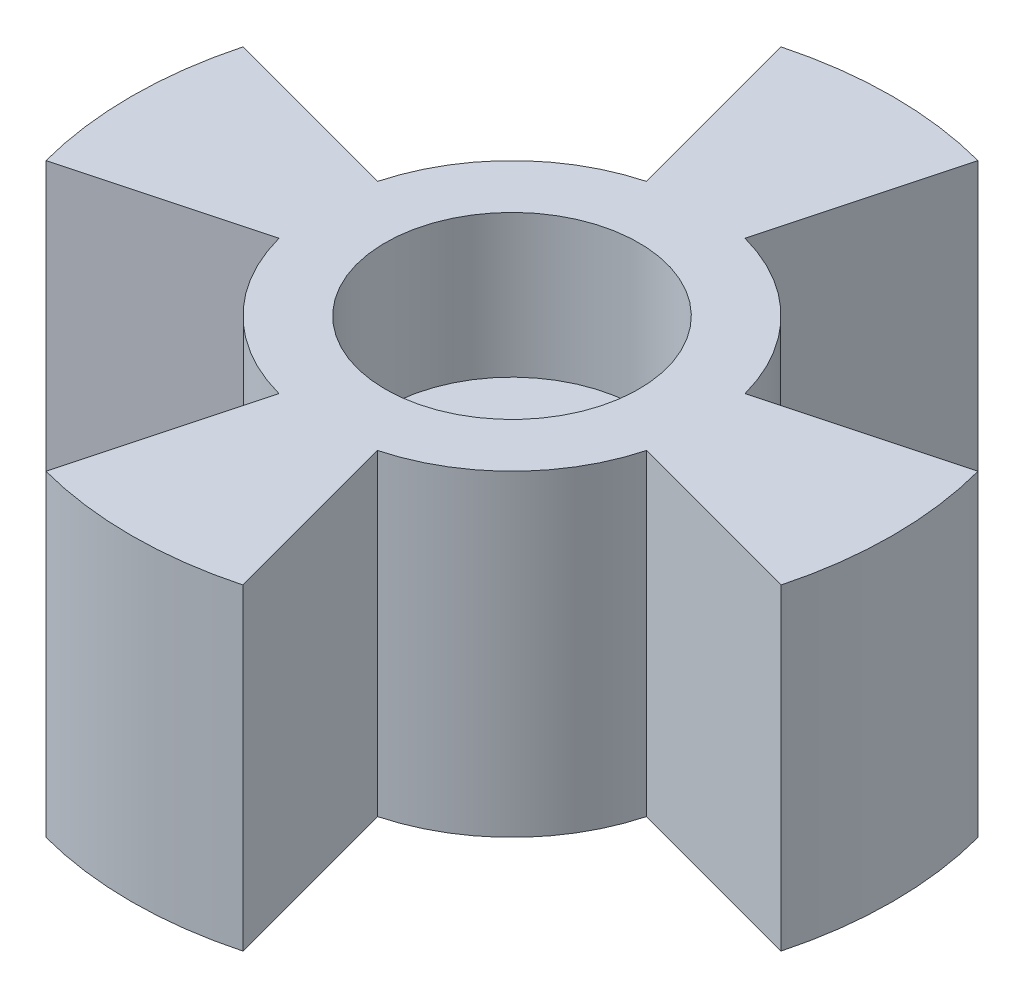
ISO-10303-21;
HEADER;
FILE_DESCRIPTION(('STEP AP214'),'2;1');
FILE_NAME('part.step','',(''),(''),'','','');
FILE_SCHEMA(('AUTOMOTIVE_DESIGN { 1 0 10303 214 1 1 1 1 }'));
ENDSEC;
DATA;
#1=APPLICATION_CONTEXT('core data for automotive mechanical design processes');
#2=APPLICATION_PROTOCOL_DEFINITION('international standard','automotive_design',2000,#1);
#3=PRODUCT_CONTEXT('',#1,'mechanical');
#4=PRODUCT('Part','Part','',(#3));
#5=PRODUCT_RELATED_PRODUCT_CATEGORY('part','',(#4));
#6=PRODUCT_DEFINITION_FORMATION('','',#4);
#7=PRODUCT_DEFINITION_CONTEXT('part definition',#1,'design');
#8=PRODUCT_DEFINITION('design','',#6,#7);
#9=PRODUCT_DEFINITION_SHAPE('','',#8);
#10=(LENGTH_UNIT() NAMED_UNIT(*) SI_UNIT(.MILLI.,.METRE.));
#11=(NAMED_UNIT(*) PLANE_ANGLE_UNIT() SI_UNIT($,.RADIAN.));
#12=(NAMED_UNIT(*) SI_UNIT($,.STERADIAN.) SOLID_ANGLE_UNIT());
#13=UNCERTAINTY_MEASURE_WITH_UNIT(LENGTH_MEASURE(1.E-05),#10,'distance_accuracy_value','');
#14=(GEOMETRIC_REPRESENTATION_CONTEXT(3) GLOBAL_UNCERTAINTY_ASSIGNED_CONTEXT((#13)) GLOBAL_UNIT_ASSIGNED_CONTEXT((#10,
#11,#12)) REPRESENTATION_CONTEXT('',''));
#15=CARTESIAN_POINT('',(0.,0.,0.));
#16=DIRECTION('',(0.,0.,1.));
#17=DIRECTION('',(1.,0.,0.));
#18=AXIS2_PLACEMENT_3D('',#15,#16,#17);
#19=CARTESIAN_POINT('',(0.,5.5,0.));
#20=DIRECTION('',(0.,1.,0.));
#21=DIRECTION('',(0.,0.,1.));
#22=AXIS2_PLACEMENT_3D('',#19,#20,#21);
#23=PLANE('',#22);
#24=CARTESIAN_POINT('',(0.,5.5,0.));
#25=DIRECTION('',(0.,1.,0.));
#26=DIRECTION('',(0.,0.,1.));
#27=AXIS2_PLACEMENT_3D('',#24,#25,#26);
#28=CIRCLE('',#27,4.);
#29=CARTESIAN_POINT('',(0.,5.5,4.));
#30=VERTEX_POINT('',#29);
#31=EDGE_CURVE('E20',#30,#30,#28,.T.);
#32=ORIENTED_EDGE('',*,*,#31,.T.);
#33=EDGE_LOOP('',(#32));
#34=FACE_BOUND('',#33,.T.);
#35=ADVANCED_FACE('F17',(#34),#23,.T.);
#36=CARTESIAN_POINT('',(0.,5.5,0.));
#37=DIRECTION('',(0.,1.,0.));
#38=DIRECTION('',(0.,0.,1.));
#39=AXIS2_PLACEMENT_3D('',#36,#37,#38);
#40=CYLINDRICAL_SURFACE('',#39,4.);
#41=CARTESIAN_POINT('',(0.,10.,0.));
#42=DIRECTION('',(0.,1.,0.));
#43=DIRECTION('',(0.,0.,1.));
#44=AXIS2_PLACEMENT_3D('',#41,#42,#43);
#45=CIRCLE('',#44,4.);
#46=CARTESIAN_POINT('',(0.,10.,4.));
#47=VERTEX_POINT('',#46);
#48=EDGE_CURVE('E155',#47,#47,#45,.F.);
#49=ORIENTED_EDGE('',*,*,#48,.F.);
#50=EDGE_LOOP('',(#49));
#51=FACE_BOUND('',#50,.T.);
#52=ORIENTED_EDGE('',*,*,#31,.F.);
#53=EDGE_LOOP('',(#52));
#54=FACE_BOUND('',#53,.T.);
#55=ADVANCED_FACE('F241',(#51,#54),#40,.F.);
#56=CARTESIAN_POINT('',(0.,4.5,0.));
#57=DIRECTION('',(0.,-1.,0.));
#58=DIRECTION('',(0.,0.,-1.));
#59=AXIS2_PLACEMENT_3D('',#56,#57,#58);
#60=PLANE('',#59);
#61=CARTESIAN_POINT('',(0.,4.5,0.));
#62=DIRECTION('',(0.,-1.,0.));
#63=DIRECTION('',(0.,0.,-1.));
#64=AXIS2_PLACEMENT_3D('',#61,#62,#63);
#65=CIRCLE('',#64,4.);
#66=CARTESIAN_POINT('',(0.,4.5,-4.));
#67=VERTEX_POINT('',#66);
#68=EDGE_CURVE('E152',#67,#67,#65,.T.);
#69=ORIENTED_EDGE('',*,*,#68,.T.);
#70=EDGE_LOOP('',(#69));
#71=FACE_BOUND('',#70,.T.);
#72=ADVANCED_FACE('F243',(#71),#60,.T.);
#73=CARTESIAN_POINT('',(0.,10.,0.));
#74=DIRECTION('',(0.,1.,0.));
#75=DIRECTION('',(0.,0.,1.));
#76=AXIS2_PLACEMENT_3D('',#73,#74,#75);
#77=PLANE('',#76);
#78=CARTESIAN_POINT('',(0.,10.,0.));
#79=DIRECTION('',(0.,-1.,0.));
#80=DIRECTION('',(0.,0.,-1.));
#81=AXIS2_PLACEMENT_3D('',#78,#79,#80);
#82=CIRCLE('',#81,6.00000000000029);
#83=CARTESIAN_POINT('',(1.55291427061518,10.,-5.7955549577347));
#84=VERTEX_POINT('',#83);
#85=CARTESIAN_POINT('',(5.79555495773471,10.,-1.55291427061512));
#86=VERTEX_POINT('',#85);
#87=EDGE_CURVE('E165',#84,#86,#82,.T.);
#88=ORIENTED_EDGE('',*,*,#87,.F.);
#89=DIRECTION('',(-0.258819045102518,0.,0.965925826289069));
#90=VECTOR('',#89,1.);
#91=CARTESIAN_POINT('',(1.55291427061518,10.,-5.7955549577347));
#92=LINE('',#91,#90);
#93=CARTESIAN_POINT('',(3.10582854123021,10.,-11.5911099154688));
#94=VERTEX_POINT('',#93);
#95=EDGE_CURVE('E139',#84,#94,#92,.F.);
#96=ORIENTED_EDGE('',*,*,#95,.T.);
#97=CARTESIAN_POINT('',(0.,10.,0.));
#98=DIRECTION('',(0.,-1.,0.));
#99=DIRECTION('',(0.,0.,-1.));
#100=AXIS2_PLACEMENT_3D('',#97,#98,#99);
#101=CIRCLE('',#100,12.);
#102=CARTESIAN_POINT('',(-3.10582854123021,10.,-11.5911099154688));
#103=VERTEX_POINT('',#102);
#104=EDGE_CURVE('E132',#103,#94,#101,.T.);
#105=ORIENTED_EDGE('',*,*,#104,.F.);
#106=DIRECTION('',(-0.258819045102528,0.,-0.965925826289066));
#107=VECTOR('',#106,1.);
#108=CARTESIAN_POINT('',(-1.55291427061512,10.,-5.79555495773471));
#109=LINE('',#108,#107);
#110=CARTESIAN_POINT('',(-1.55291427061512,10.,-5.79555495773471));
#111=VERTEX_POINT('',#110);
#112=EDGE_CURVE('E136',#103,#111,#109,.F.);
#113=ORIENTED_EDGE('',*,*,#112,.T.);
#114=CARTESIAN_POINT('',(0.,10.,0.));
#115=DIRECTION('',(0.,-1.,0.));
#116=DIRECTION('',(0.,0.,-1.));
#117=AXIS2_PLACEMENT_3D('',#114,#115,#116);
#118=CIRCLE('',#117,6.00000000000029);
#119=CARTESIAN_POINT('',(-5.7955549577347,10.,-1.55291427061518));
#120=VERTEX_POINT('',#119);
#121=EDGE_CURVE('E127',#120,#111,#118,.T.);
#122=ORIENTED_EDGE('',*,*,#121,.F.);
#123=DIRECTION('',(0.965925826289064,0.,0.258819045102538));
#124=VECTOR('',#123,1.);
#125=CARTESIAN_POINT('',(-5.7955549577347,10.,-1.55291427061518));
#126=LINE('',#125,#124);
#127=CARTESIAN_POINT('',(-11.5911099154688,10.,-3.10582854123033));
#128=VERTEX_POINT('',#127);
#129=EDGE_CURVE('E187',#120,#128,#126,.F.);
#130=ORIENTED_EDGE('',*,*,#129,.T.);
#131=CARTESIAN_POINT('',(0.,10.,0.));
#132=DIRECTION('',(0.,-1.,0.));
#133=DIRECTION('',(0.,0.,-1.));
#134=AXIS2_PLACEMENT_3D('',#131,#132,#133);
#135=CIRCLE('',#134,12.);
#136=CARTESIAN_POINT('',(-11.5911099154689,10.,3.10582854123009));
#137=VERTEX_POINT('',#136);
#138=EDGE_CURVE('E189',#137,#128,#135,.T.);
#139=ORIENTED_EDGE('',*,*,#138,.F.);
#140=DIRECTION('',(-0.965925826289072,0.,0.258819045102508));
#141=VECTOR('',#140,1.);
#142=CARTESIAN_POINT('',(-5.79555495773471,10.,1.55291427061512));
#143=LINE('',#142,#141);
#144=CARTESIAN_POINT('',(-5.79555495773471,10.,1.55291427061512));
#145=VERTEX_POINT('',#144);
#146=EDGE_CURVE('E182',#137,#145,#143,.F.);
#147=ORIENTED_EDGE('',*,*,#146,.T.);
#148=CARTESIAN_POINT('',(0.,10.,0.));
#149=DIRECTION('',(0.,-1.,0.));
#150=DIRECTION('',(0.,0.,-1.));
#151=AXIS2_PLACEMENT_3D('',#148,#149,#150);
#152=CIRCLE('',#151,6.00000000000029);
#153=CARTESIAN_POINT('',(-1.55291427061518,10.,5.7955549577347));
#154=VERTEX_POINT('',#153);
#155=EDGE_CURVE('E185',#154,#145,#152,.T.);
#156=ORIENTED_EDGE('',*,*,#155,.F.);
#157=DIRECTION('',(0.258819045102532,0.,-0.965925826289065));
#158=VECTOR('',#157,1.);
#159=CARTESIAN_POINT('',(-1.55291427061518,10.,5.7955549577347));
#160=LINE('',#159,#158);
#161=CARTESIAN_POINT('',(-3.10582854123029,10.,11.5911099154688));
#162=VERTEX_POINT('',#161);
#163=EDGE_CURVE('E177',#154,#162,#160,.F.);
#164=ORIENTED_EDGE('',*,*,#163,.T.);
#165=CARTESIAN_POINT('',(0.,10.,0.));
#166=DIRECTION('',(0.,-1.,0.));
#167=DIRECTION('',(0.,0.,-1.));
#168=AXIS2_PLACEMENT_3D('',#165,#166,#167);
#169=CIRCLE('',#168,12.);
#170=CARTESIAN_POINT('',(3.10582854123013,10.,11.5911099154688));
#171=VERTEX_POINT('',#170);
#172=EDGE_CURVE('E180',#171,#162,#169,.T.);
#173=ORIENTED_EDGE('',*,*,#172,.F.);
#174=DIRECTION('',(0.258819045102514,0.,0.96592582628907));
#175=VECTOR('',#174,1.);
#176=CARTESIAN_POINT('',(1.55291427061512,10.,5.79555495773471));
#177=LINE('',#176,#175);
#178=CARTESIAN_POINT('',(1.55291427061512,10.,5.79555495773471));
#179=VERTEX_POINT('',#178);
#180=EDGE_CURVE('E172',#171,#179,#177,.F.);
#181=ORIENTED_EDGE('',*,*,#180,.T.);
#182=CARTESIAN_POINT('',(0.,10.,0.));
#183=DIRECTION('',(0.,-1.,0.));
#184=DIRECTION('',(0.,0.,-1.));
#185=AXIS2_PLACEMENT_3D('',#182,#183,#184);
#186=CIRCLE('',#185,6.00000000000029);
#187=CARTESIAN_POINT('',(5.7955549577347,10.,1.55291427061518));
#188=VERTEX_POINT('',#187);
#189=EDGE_CURVE('E175',#188,#179,#186,.T.);
#190=ORIENTED_EDGE('',*,*,#189,.F.);
#191=DIRECTION('',(-0.965925826289067,0.,-0.258819045102524));
#192=VECTOR('',#191,1.);
#193=CARTESIAN_POINT('',(5.7955549577347,10.,1.55291427061518));
#194=LINE('',#193,#192);
#195=CARTESIAN_POINT('',(11.5911099154688,10.,3.10582854123025));
#196=VERTEX_POINT('',#195);
#197=EDGE_CURVE('E167',#188,#196,#194,.F.);
#198=ORIENTED_EDGE('',*,*,#197,.T.);
#199=CARTESIAN_POINT('',(0.,10.,0.));
#200=DIRECTION('',(0.,-1.,0.));
#201=DIRECTION('',(0.,0.,-1.));
#202=AXIS2_PLACEMENT_3D('',#199,#200,#201);
#203=CIRCLE('',#202,12.);
#204=CARTESIAN_POINT('',(11.5911099154688,10.,-3.10582854123017));
#205=VERTEX_POINT('',#204);
#206=EDGE_CURVE('E170',#205,#196,#203,.T.);
#207=ORIENTED_EDGE('',*,*,#206,.F.);
#208=DIRECTION('',(0.965925826289068,0.,-0.258819045102521));
#209=VECTOR('',#208,1.);
#210=CARTESIAN_POINT('',(5.79555495773471,10.,-1.55291427061512));
#211=LINE('',#210,#209);
#212=EDGE_CURVE('E162',#205,#86,#211,.F.);
#213=ORIENTED_EDGE('',*,*,#212,.T.);
#214=EDGE_LOOP('',(#88,#96,#105,#113,#122,#130,#139,#147,#156,#164,#173,#181,#190,#198,#207,#213));
#215=FACE_BOUND('',#214,.T.);
#216=ORIENTED_EDGE('',*,*,#48,.T.);
#217=EDGE_LOOP('',(#216));
#218=FACE_BOUND('',#217,.T.);
#219=ADVANCED_FACE('F134',(#215,#218),#77,.T.);
#220=CARTESIAN_POINT('',(0.,4.5,0.));
#221=DIRECTION('',(0.,-1.,0.));
#222=DIRECTION('',(0.,0.,-1.));
#223=AXIS2_PLACEMENT_3D('',#220,#221,#222);
#224=CYLINDRICAL_SURFACE('',#223,4.);
#225=ORIENTED_EDGE('',*,*,#68,.F.);
#226=EDGE_LOOP('',(#225));
#227=FACE_BOUND('',#226,.T.);
#228=CARTESIAN_POINT('',(0.,0.,0.));
#229=DIRECTION('',(0.,-1.,0.));
#230=DIRECTION('',(0.,0.,-1.));
#231=AXIS2_PLACEMENT_3D('',#228,#229,#230);
#232=CIRCLE('',#231,4.);
#233=CARTESIAN_POINT('',(0.,0.,-4.));
#234=VERTEX_POINT('',#233);
#235=EDGE_CURVE('E220',#234,#234,#232,.T.);
#236=ORIENTED_EDGE('',*,*,#235,.T.);
#237=EDGE_LOOP('',(#236));
#238=FACE_BOUND('',#237,.T.);
#239=ADVANCED_FACE('F318',(#227,#238),#224,.F.);
#240=CARTESIAN_POINT('',(-1.55291427061512,10.,-5.79555495773471));
#241=DIRECTION('',(0.965925826289066,0.,-0.258819045102528));
#242=DIRECTION('',(-0.258819045102528,0.,-0.965925826289066));
#243=AXIS2_PLACEMENT_3D('',#240,#241,#242);
#244=PLANE('',#243);
#245=DIRECTION('',(0.,-1.,0.));
#246=VECTOR('',#245,1.);
#247=CARTESIAN_POINT('',(-1.55291427061512,10.,-5.79555495773471));
#248=LINE('',#247,#246);
#249=CARTESIAN_POINT('',(-1.55291427061512,0.,-5.79555495773471));
#250=VERTEX_POINT('',#249);
#251=EDGE_CURVE('E149',#111,#250,#248,.T.);
#252=ORIENTED_EDGE('',*,*,#251,.F.);
#253=ORIENTED_EDGE('',*,*,#112,.F.);
#254=DIRECTION('',(0.,1.,0.));
#255=VECTOR('',#254,1.);
#256=CARTESIAN_POINT('',(-3.10582854123021,10.,-11.5911099154688));
#257=LINE('',#256,#255);
#258=CARTESIAN_POINT('',(-3.10582854123021,0.,-11.5911099154688));
#259=VERTEX_POINT('',#258);
#260=EDGE_CURVE('E148',#259,#103,#257,.T.);
#261=ORIENTED_EDGE('',*,*,#260,.F.);
#262=DIRECTION('',(0.258819045102528,0.,0.965925826289066));
#263=VECTOR('',#262,1.);
#264=CARTESIAN_POINT('',(-3.10582854123021,0.,-11.5911099154688));
#265=LINE('',#264,#263);
#266=EDGE_CURVE('E218',#259,#250,#265,.T.);
#267=ORIENTED_EDGE('',*,*,#266,.T.);
#268=EDGE_LOOP('',(#252,#253,#261,#267));
#269=FACE_BOUND('',#268,.T.);
#270=ADVANCED_FACE('F146',(#269),#244,.F.);
#271=CARTESIAN_POINT('',(0.,10.,0.));
#272=DIRECTION('',(0.,-1.,0.));
#273=DIRECTION('',(0.,0.,-1.));
#274=AXIS2_PLACEMENT_3D('',#271,#272,#273);
#275=CYLINDRICAL_SURFACE('',#274,6.00000000000029);
#276=ORIENTED_EDGE('',*,*,#121,.T.);
#277=ORIENTED_EDGE('',*,*,#251,.T.);
#278=CARTESIAN_POINT('',(0.,0.,0.));
#279=DIRECTION('',(0.,-1.,0.));
#280=DIRECTION('',(0.,0.,-1.));
#281=AXIS2_PLACEMENT_3D('',#278,#279,#280);
#282=CIRCLE('',#281,6.00000000000029);
#283=CARTESIAN_POINT('',(-5.7955549577347,0.,-1.55291427061518));
#284=VERTEX_POINT('',#283);
#285=EDGE_CURVE('E215',#250,#284,#282,.F.);
#286=ORIENTED_EDGE('',*,*,#285,.T.);
#287=DIRECTION('',(0.,1.,0.));
#288=VECTOR('',#287,1.);
#289=CARTESIAN_POINT('',(-5.7955549577347,10.,-1.55291427061518));
#290=LINE('',#289,#288);
#291=EDGE_CURVE('E190',#284,#120,#290,.T.);
#292=ORIENTED_EDGE('',*,*,#291,.T.);
#293=EDGE_LOOP('',(#276,#277,#286,#292));
#294=FACE_BOUND('',#293,.T.);
#295=ADVANCED_FACE('F312',(#294),#275,.T.);
#296=CARTESIAN_POINT('',(-5.7955549577347,10.,-1.55291427061518));
#297=DIRECTION('',(-0.258819045102538,0.,0.965925826289064));
#298=DIRECTION('',(0.965925826289064,0.,0.258819045102538));
#299=AXIS2_PLACEMENT_3D('',#296,#297,#298);
#300=PLANE('',#299);
#301=DIRECTION('',(0.,-1.,0.));
#302=VECTOR('',#301,1.);
#303=CARTESIAN_POINT('',(-11.5911099154688,10.,-3.10582854123033));
#304=LINE('',#303,#302);
#305=CARTESIAN_POINT('',(-11.5911099154688,0.,-3.10582854123033));
#306=VERTEX_POINT('',#305);
#307=EDGE_CURVE('E234',#128,#306,#304,.T.);
#308=ORIENTED_EDGE('',*,*,#307,.F.);
#309=ORIENTED_EDGE('',*,*,#129,.F.);
#310=ORIENTED_EDGE('',*,*,#291,.F.);
#311=DIRECTION('',(-0.965925826289063,0.,-0.258819045102538));
#312=VECTOR('',#311,1.);
#313=CARTESIAN_POINT('',(-5.7955549577347,0.,-1.55291427061518));
#314=LINE('',#313,#312);
#315=EDGE_CURVE('E214',#284,#306,#314,.T.);
#316=ORIENTED_EDGE('',*,*,#315,.T.);
#317=EDGE_LOOP('',(#308,#309,#310,#316));
#318=FACE_BOUND('',#317,.T.);
#319=ADVANCED_FACE('F308',(#318),#300,.F.);
#320=CARTESIAN_POINT('',(0.,10.,0.));
#321=DIRECTION('',(0.,-1.,0.));
#322=DIRECTION('',(0.,0.,-1.));
#323=AXIS2_PLACEMENT_3D('',#320,#321,#322);
#324=CYLINDRICAL_SURFACE('',#323,12.);
#325=ORIENTED_EDGE('',*,*,#138,.T.);
#326=ORIENTED_EDGE('',*,*,#307,.T.);
#327=CARTESIAN_POINT('',(0.,0.,0.));
#328=DIRECTION('',(0.,-1.,0.));
#329=DIRECTION('',(0.,0.,-1.));
#330=AXIS2_PLACEMENT_3D('',#327,#328,#329);
#331=CIRCLE('',#330,12.);
#332=CARTESIAN_POINT('',(-11.5911099154689,0.,3.10582854123009));
#333=VERTEX_POINT('',#332);
#334=EDGE_CURVE('E211',#306,#333,#331,.F.);
#335=ORIENTED_EDGE('',*,*,#334,.T.);
#336=DIRECTION('',(0.,1.,0.));
#337=VECTOR('',#336,1.);
#338=CARTESIAN_POINT('',(-11.5911099154689,10.,3.10582854123009));
#339=LINE('',#338,#337);
#340=EDGE_CURVE('E186',#333,#137,#339,.T.);
#341=ORIENTED_EDGE('',*,*,#340,.T.);
#342=EDGE_LOOP('',(#325,#326,#335,#341));
#343=FACE_BOUND('',#342,.T.);
#344=ADVANCED_FACE('F304',(#343),#324,.T.);
#345=CARTESIAN_POINT('',(-5.79555495773471,10.,1.55291427061512));
#346=DIRECTION('',(-0.258819045102508,0.,-0.965925826289072));
#347=DIRECTION('',(-0.965925826289072,0.,0.258819045102508));
#348=AXIS2_PLACEMENT_3D('',#345,#346,#347);
#349=PLANE('',#348);
#350=DIRECTION('',(0.,-1.,0.));
#351=VECTOR('',#350,1.);
#352=CARTESIAN_POINT('',(-5.79555495773471,10.,1.55291427061512));
#353=LINE('',#352,#351);
#354=CARTESIAN_POINT('',(-5.79555495773471,0.,1.55291427061512));
#355=VERTEX_POINT('',#354);
#356=EDGE_CURVE('E232',#145,#355,#353,.T.);
#357=ORIENTED_EDGE('',*,*,#356,.F.);
#358=ORIENTED_EDGE('',*,*,#146,.F.);
#359=ORIENTED_EDGE('',*,*,#340,.F.);
#360=DIRECTION('',(0.965925826289072,0.,-0.258819045102507));
#361=VECTOR('',#360,1.);
#362=CARTESIAN_POINT('',(-11.5911099154689,0.,3.10582854123009));
#363=LINE('',#362,#361);
#364=EDGE_CURVE('E210',#333,#355,#363,.T.);
#365=ORIENTED_EDGE('',*,*,#364,.T.);
#366=EDGE_LOOP('',(#357,#358,#359,#365));
#367=FACE_BOUND('',#366,.T.);
#368=ADVANCED_FACE('F300',(#367),#349,.F.);
#369=CARTESIAN_POINT('',(0.,10.,0.));
#370=DIRECTION('',(0.,-1.,0.));
#371=DIRECTION('',(0.,0.,-1.));
#372=AXIS2_PLACEMENT_3D('',#369,#370,#371);
#373=CYLINDRICAL_SURFACE('',#372,6.00000000000029);
#374=ORIENTED_EDGE('',*,*,#155,.T.);
#375=ORIENTED_EDGE('',*,*,#356,.T.);
#376=CARTESIAN_POINT('',(0.,0.,0.));
#377=DIRECTION('',(0.,-1.,0.));
#378=DIRECTION('',(0.,0.,-1.));
#379=AXIS2_PLACEMENT_3D('',#376,#377,#378);
#380=CIRCLE('',#379,6.00000000000029);
#381=CARTESIAN_POINT('',(-1.55291427061518,0.,5.7955549577347));
#382=VERTEX_POINT('',#381);
#383=EDGE_CURVE('E207',#355,#382,#380,.F.);
#384=ORIENTED_EDGE('',*,*,#383,.T.);
#385=DIRECTION('',(0.,1.,0.));
#386=VECTOR('',#385,1.);
#387=CARTESIAN_POINT('',(-1.55291427061518,10.,5.7955549577347));
#388=LINE('',#387,#386);
#389=EDGE_CURVE('E181',#382,#154,#388,.T.);
#390=ORIENTED_EDGE('',*,*,#389,.T.);
#391=EDGE_LOOP('',(#374,#375,#384,#390));
#392=FACE_BOUND('',#391,.T.);
#393=ADVANCED_FACE('F296',(#392),#373,.T.);
#394=CARTESIAN_POINT('',(-1.55291427061518,10.,5.7955549577347));
#395=DIRECTION('',(0.965925826289065,0.,0.258819045102532));
#396=DIRECTION('',(0.258819045102532,0.,-0.965925826289065));
#397=AXIS2_PLACEMENT_3D('',#394,#395,#396);
#398=PLANE('',#397);
#399=DIRECTION('',(0.,-1.,0.));
#400=VECTOR('',#399,1.);
#401=CARTESIAN_POINT('',(-3.10582854123029,10.,11.5911099154688));
#402=LINE('',#401,#400);
#403=CARTESIAN_POINT('',(-3.10582854123029,0.,11.5911099154688));
#404=VERTEX_POINT('',#403);
#405=EDGE_CURVE('E230',#162,#404,#402,.T.);
#406=ORIENTED_EDGE('',*,*,#405,.F.);
#407=ORIENTED_EDGE('',*,*,#163,.F.);
#408=ORIENTED_EDGE('',*,*,#389,.F.);
#409=DIRECTION('',(-0.258819045102531,0.,0.965925826289066));
#410=VECTOR('',#409,1.);
#411=CARTESIAN_POINT('',(-1.55291427061518,0.,5.7955549577347));
#412=LINE('',#411,#410);
#413=EDGE_CURVE('E206',#382,#404,#412,.T.);
#414=ORIENTED_EDGE('',*,*,#413,.T.);
#415=EDGE_LOOP('',(#406,#407,#408,#414));
#416=FACE_BOUND('',#415,.T.);
#417=ADVANCED_FACE('F292',(#416),#398,.F.);
#418=CARTESIAN_POINT('',(0.,10.,0.));
#419=DIRECTION('',(0.,-1.,0.));
#420=DIRECTION('',(0.,0.,-1.));
#421=AXIS2_PLACEMENT_3D('',#418,#419,#420);
#422=CYLINDRICAL_SURFACE('',#421,12.);
#423=ORIENTED_EDGE('',*,*,#172,.T.);
#424=ORIENTED_EDGE('',*,*,#405,.T.);
#425=CARTESIAN_POINT('',(0.,0.,0.));
#426=DIRECTION('',(0.,-1.,0.));
#427=DIRECTION('',(0.,0.,-1.));
#428=AXIS2_PLACEMENT_3D('',#425,#426,#427);
#429=CIRCLE('',#428,12.);
#430=CARTESIAN_POINT('',(3.10582854123013,0.,11.5911099154688));
#431=VERTEX_POINT('',#430);
#432=EDGE_CURVE('E203',#404,#431,#429,.F.);
#433=ORIENTED_EDGE('',*,*,#432,.T.);
#434=DIRECTION('',(0.,1.,0.));
#435=VECTOR('',#434,1.);
#436=CARTESIAN_POINT('',(3.10582854123013,10.,11.5911099154688));
#437=LINE('',#436,#435);
#438=EDGE_CURVE('E176',#431,#171,#437,.T.);
#439=ORIENTED_EDGE('',*,*,#438,.T.);
#440=EDGE_LOOP('',(#423,#424,#433,#439));
#441=FACE_BOUND('',#440,.T.);
#442=ADVANCED_FACE('F288',(#441),#422,.T.);
#443=CARTESIAN_POINT('',(1.55291427061512,10.,5.79555495773471));
#444=DIRECTION('',(-0.96592582628907,0.,0.258819045102514));
#445=DIRECTION('',(0.258819045102514,0.,0.96592582628907));
#446=AXIS2_PLACEMENT_3D('',#443,#444,#445);
#447=PLANE('',#446);
#448=DIRECTION('',(0.,-1.,0.));
#449=VECTOR('',#448,1.);
#450=CARTESIAN_POINT('',(1.55291427061512,10.,5.79555495773471));
#451=LINE('',#450,#449);
#452=CARTESIAN_POINT('',(1.55291427061512,0.,5.79555495773471));
#453=VERTEX_POINT('',#452);
#454=EDGE_CURVE('E228',#179,#453,#451,.T.);
#455=ORIENTED_EDGE('',*,*,#454,.F.);
#456=ORIENTED_EDGE('',*,*,#180,.F.);
#457=ORIENTED_EDGE('',*,*,#438,.F.);
#458=DIRECTION('',(-0.258819045102514,0.,-0.96592582628907));
#459=VECTOR('',#458,1.);
#460=CARTESIAN_POINT('',(3.10582854123013,0.,11.5911099154688));
#461=LINE('',#460,#459);
#462=EDGE_CURVE('E202',#431,#453,#461,.T.);
#463=ORIENTED_EDGE('',*,*,#462,.T.);
#464=EDGE_LOOP('',(#455,#456,#457,#463));
#465=FACE_BOUND('',#464,.T.);
#466=ADVANCED_FACE('F284',(#465),#447,.F.);
#467=CARTESIAN_POINT('',(0.,10.,0.));
#468=DIRECTION('',(0.,-1.,0.));
#469=DIRECTION('',(0.,0.,-1.));
#470=AXIS2_PLACEMENT_3D('',#467,#468,#469);
#471=CYLINDRICAL_SURFACE('',#470,6.00000000000029);
#472=ORIENTED_EDGE('',*,*,#189,.T.);
#473=ORIENTED_EDGE('',*,*,#454,.T.);
#474=CARTESIAN_POINT('',(0.,0.,0.));
#475=DIRECTION('',(0.,-1.,0.));
#476=DIRECTION('',(0.,0.,-1.));
#477=AXIS2_PLACEMENT_3D('',#474,#475,#476);
#478=CIRCLE('',#477,6.00000000000029);
#479=CARTESIAN_POINT('',(5.7955549577347,0.,1.55291427061518));
#480=VERTEX_POINT('',#479);
#481=EDGE_CURVE('E199',#453,#480,#478,.F.);
#482=ORIENTED_EDGE('',*,*,#481,.T.);
#483=DIRECTION('',(0.,1.,0.));
#484=VECTOR('',#483,1.);
#485=CARTESIAN_POINT('',(5.7955549577347,10.,1.55291427061518));
#486=LINE('',#485,#484);
#487=EDGE_CURVE('E171',#480,#188,#486,.T.);
#488=ORIENTED_EDGE('',*,*,#487,.T.);
#489=EDGE_LOOP('',(#472,#473,#482,#488));
#490=FACE_BOUND('',#489,.T.);
#491=ADVANCED_FACE('F280',(#490),#471,.T.);
#492=CARTESIAN_POINT('',(5.7955549577347,10.,1.55291427061518));
#493=DIRECTION('',(0.258819045102524,0.,-0.965925826289067));
#494=DIRECTION('',(-0.965925826289067,0.,-0.258819045102524));
#495=AXIS2_PLACEMENT_3D('',#492,#493,#494);
#496=PLANE('',#495);
#497=DIRECTION('',(0.,-1.,0.));
#498=VECTOR('',#497,1.);
#499=CARTESIAN_POINT('',(11.5911099154688,10.,3.10582854123025));
#500=LINE('',#499,#498);
#501=CARTESIAN_POINT('',(11.5911099154688,0.,3.10582854123025));
#502=VERTEX_POINT('',#501);
#503=EDGE_CURVE('E226',#196,#502,#500,.T.);
#504=ORIENTED_EDGE('',*,*,#503,.F.);
#505=ORIENTED_EDGE('',*,*,#197,.F.);
#506=ORIENTED_EDGE('',*,*,#487,.F.);
#507=DIRECTION('',(0.965925826289067,0.,0.258819045102524));
#508=VECTOR('',#507,1.);
#509=CARTESIAN_POINT('',(5.7955549577347,0.,1.55291427061518));
#510=LINE('',#509,#508);
#511=EDGE_CURVE('E198',#480,#502,#510,.T.);
#512=ORIENTED_EDGE('',*,*,#511,.T.);
#513=EDGE_LOOP('',(#504,#505,#506,#512));
#514=FACE_BOUND('',#513,.T.);
#515=ADVANCED_FACE('F276',(#514),#496,.F.);
#516=CARTESIAN_POINT('',(0.,10.,0.));
#517=DIRECTION('',(0.,-1.,0.));
#518=DIRECTION('',(0.,0.,-1.));
#519=AXIS2_PLACEMENT_3D('',#516,#517,#518);
#520=CYLINDRICAL_SURFACE('',#519,12.);
#521=ORIENTED_EDGE('',*,*,#206,.T.);
#522=ORIENTED_EDGE('',*,*,#503,.T.);
#523=CARTESIAN_POINT('',(0.,0.,0.));
#524=DIRECTION('',(0.,-1.,0.));
#525=DIRECTION('',(0.,0.,-1.));
#526=AXIS2_PLACEMENT_3D('',#523,#524,#525);
#527=CIRCLE('',#526,12.);
#528=CARTESIAN_POINT('',(11.5911099154688,0.,-3.10582854123018));
#529=VERTEX_POINT('',#528);
#530=EDGE_CURVE('E195',#502,#529,#527,.F.);
#531=ORIENTED_EDGE('',*,*,#530,.T.);
#532=DIRECTION('',(0.,1.,0.));
#533=VECTOR('',#532,1.);
#534=CARTESIAN_POINT('',(11.5911099154688,10.,-3.10582854123017));
#535=LINE('',#534,#533);
#536=EDGE_CURVE('E166',#529,#205,#535,.T.);
#537=ORIENTED_EDGE('',*,*,#536,.T.);
#538=EDGE_LOOP('',(#521,#522,#531,#537));
#539=FACE_BOUND('',#538,.T.);
#540=ADVANCED_FACE('F272',(#539),#520,.T.);
#541=CARTESIAN_POINT('',(5.79555495773471,10.,-1.55291427061512));
#542=DIRECTION('',(0.258819045102521,0.,0.965925826289068));
#543=DIRECTION('',(0.965925826289068,0.,-0.258819045102521));
#544=AXIS2_PLACEMENT_3D('',#541,#542,#543);
#545=PLANE('',#544);
#546=DIRECTION('',(0.,-1.,0.));
#547=VECTOR('',#546,1.);
#548=CARTESIAN_POINT('',(5.79555495773471,10.,-1.55291427061512));
#549=LINE('',#548,#547);
#550=CARTESIAN_POINT('',(5.79555495773471,0.,-1.55291427061512));
#551=VERTEX_POINT('',#550);
#552=EDGE_CURVE('E224',#86,#551,#549,.T.);
#553=ORIENTED_EDGE('',*,*,#552,.F.);
#554=ORIENTED_EDGE('',*,*,#212,.F.);
#555=ORIENTED_EDGE('',*,*,#536,.F.);
#556=DIRECTION('',(-0.965925826289068,0.,0.258819045102522));
#557=VECTOR('',#556,1.);
#558=CARTESIAN_POINT('',(11.5911099154688,0.,-3.10582854123018));
#559=LINE('',#558,#557);
#560=EDGE_CURVE('E194',#529,#551,#559,.T.);
#561=ORIENTED_EDGE('',*,*,#560,.T.);
#562=EDGE_LOOP('',(#553,#554,#555,#561));
#563=FACE_BOUND('',#562,.T.);
#564=ADVANCED_FACE('F268',(#563),#545,.F.);
#565=CARTESIAN_POINT('',(0.,10.,0.));
#566=DIRECTION('',(0.,-1.,0.));
#567=DIRECTION('',(0.,0.,-1.));
#568=AXIS2_PLACEMENT_3D('',#565,#566,#567);
#569=CYLINDRICAL_SURFACE('',#568,6.00000000000029);
#570=ORIENTED_EDGE('',*,*,#87,.T.);
#571=ORIENTED_EDGE('',*,*,#552,.T.);
#572=CARTESIAN_POINT('',(0.,0.,0.));
#573=DIRECTION('',(0.,-1.,0.));
#574=DIRECTION('',(0.,0.,-1.));
#575=AXIS2_PLACEMENT_3D('',#572,#573,#574);
#576=CIRCLE('',#575,6.00000000000029);
#577=CARTESIAN_POINT('',(1.55291427061518,0.,-5.7955549577347));
#578=VERTEX_POINT('',#577);
#579=EDGE_CURVE('E26',#551,#578,#576,.F.);
#580=ORIENTED_EDGE('',*,*,#579,.T.);
#581=DIRECTION('',(0.,1.,0.));
#582=VECTOR('',#581,1.);
#583=CARTESIAN_POINT('',(1.55291427061518,10.,-5.7955549577347));
#584=LINE('',#583,#582);
#585=EDGE_CURVE('E161',#578,#84,#584,.T.);
#586=ORIENTED_EDGE('',*,*,#585,.T.);
#587=EDGE_LOOP('',(#570,#571,#580,#586));
#588=FACE_BOUND('',#587,.T.);
#589=ADVANCED_FACE('F264',(#588),#569,.T.);
#590=CARTESIAN_POINT('',(1.55291427061518,10.,-5.7955549577347));
#591=DIRECTION('',(-0.965925826289069,0.,-0.258819045102518));
#592=DIRECTION('',(-0.258819045102518,0.,0.965925826289069));
#593=AXIS2_PLACEMENT_3D('',#590,#591,#592);
#594=PLANE('',#593);
#595=DIRECTION('',(0.,-1.,0.));
#596=VECTOR('',#595,1.);
#597=CARTESIAN_POINT('',(3.10582854123021,10.,-11.5911099154688));
#598=LINE('',#597,#596);
#599=CARTESIAN_POINT('',(3.10582854123021,0.,-11.5911099154688));
#600=VERTEX_POINT('',#599);
#601=EDGE_CURVE('E143',#94,#600,#598,.T.);
#602=ORIENTED_EDGE('',*,*,#601,.F.);
#603=ORIENTED_EDGE('',*,*,#95,.F.);
#604=ORIENTED_EDGE('',*,*,#585,.F.);
#605=DIRECTION('',(0.258819045102518,0.,-0.965925826289069));
#606=VECTOR('',#605,1.);
#607=CARTESIAN_POINT('',(1.55291427061518,0.,-5.7955549577347));
#608=LINE('',#607,#606);
#609=EDGE_CURVE('E11',#578,#600,#608,.T.);
#610=ORIENTED_EDGE('',*,*,#609,.T.);
#611=EDGE_LOOP('',(#602,#603,#604,#610));
#612=FACE_BOUND('',#611,.T.);
#613=ADVANCED_FACE('F258',(#612),#594,.F.);
#614=CARTESIAN_POINT('',(0.,10.,0.));
#615=DIRECTION('',(0.,-1.,0.));
#616=DIRECTION('',(0.,0.,-1.));
#617=AXIS2_PLACEMENT_3D('',#614,#615,#616);
#618=CYLINDRICAL_SURFACE('',#617,12.);
#619=ORIENTED_EDGE('',*,*,#601,.T.);
#620=CARTESIAN_POINT('',(0.,0.,0.));
#621=DIRECTION('',(0.,-1.,0.));
#622=DIRECTION('',(0.,0.,-1.));
#623=AXIS2_PLACEMENT_3D('',#620,#621,#622);
#624=CIRCLE('',#623,12.);
#625=EDGE_CURVE('E35',#600,#259,#624,.F.);
#626=ORIENTED_EDGE('',*,*,#625,.T.);
#627=ORIENTED_EDGE('',*,*,#260,.T.);
#628=ORIENTED_EDGE('',*,*,#104,.T.);
#629=EDGE_LOOP('',(#619,#626,#627,#628));
#630=FACE_BOUND('',#629,.T.);
#631=ADVANCED_FACE('F151',(#630),#618,.T.);
#632=CARTESIAN_POINT('',(0.,0.,0.));
#633=DIRECTION('',(0.,1.,0.));
#634=DIRECTION('',(0.,0.,1.));
#635=AXIS2_PLACEMENT_3D('',#632,#633,#634);
#636=PLANE('',#635);
#637=ORIENTED_EDGE('',*,*,#609,.F.);
#638=ORIENTED_EDGE('',*,*,#579,.F.);
#639=ORIENTED_EDGE('',*,*,#560,.F.);
#640=ORIENTED_EDGE('',*,*,#530,.F.);
#641=ORIENTED_EDGE('',*,*,#511,.F.);
#642=ORIENTED_EDGE('',*,*,#481,.F.);
#643=ORIENTED_EDGE('',*,*,#462,.F.);
#644=ORIENTED_EDGE('',*,*,#432,.F.);
#645=ORIENTED_EDGE('',*,*,#413,.F.);
#646=ORIENTED_EDGE('',*,*,#383,.F.);
#647=ORIENTED_EDGE('',*,*,#364,.F.);
#648=ORIENTED_EDGE('',*,*,#334,.F.);
#649=ORIENTED_EDGE('',*,*,#315,.F.);
#650=ORIENTED_EDGE('',*,*,#285,.F.);
#651=ORIENTED_EDGE('',*,*,#266,.F.);
#652=ORIENTED_EDGE('',*,*,#625,.F.);
#653=EDGE_LOOP('',(#637,#638,#639,#640,#641,#642,#643,#644,#645,#646,#647,#648,#649,#650,#651,#652));
#654=FACE_BOUND('',#653,.T.);
#655=ORIENTED_EDGE('',*,*,#235,.F.);
#656=EDGE_LOOP('',(#655));
#657=FACE_BOUND('',#656,.T.);
#658=ADVANCED_FACE('F252',(#654,#657),#636,.F.);
#659=CLOSED_SHELL('',(#35,#55,#72,#219,#239,#270,#295,#319,#344,#368,#393,#417,#442,#466,#491,
#515,#540,#564,#589,#613,#631,#658));
#660=MANIFOLD_SOLID_BREP('B1',#659);
#661=ADVANCED_BREP_SHAPE_REPRESENTATION('',(#18,#660),#14);
#662=SHAPE_DEFINITION_REPRESENTATION(#9,#661);
ENDSEC;
END-ISO-10303-21;
